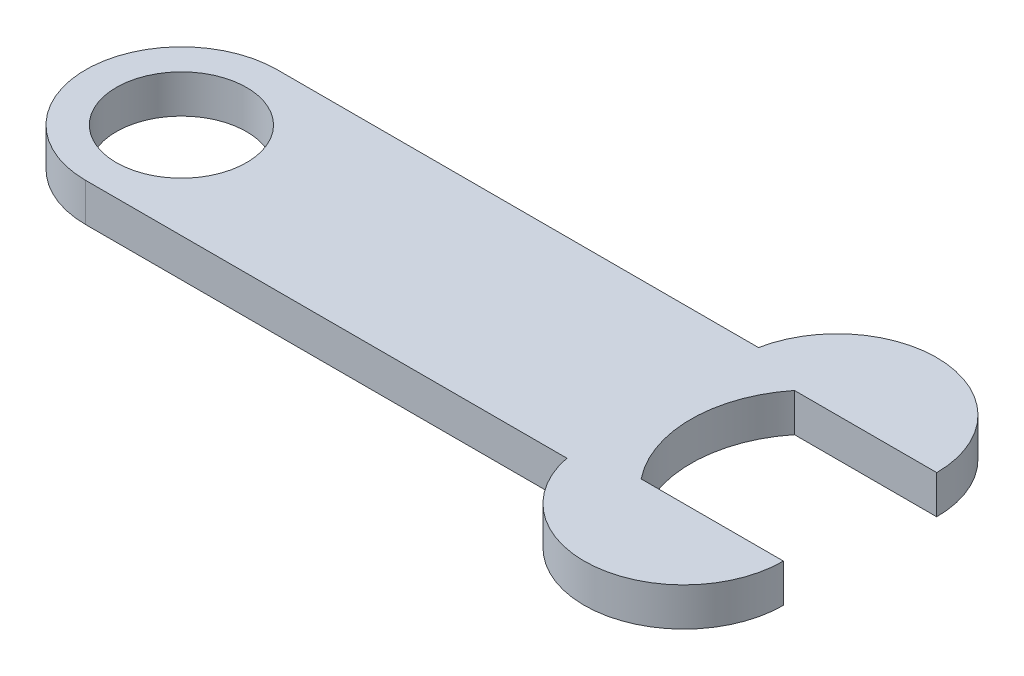
ISO-10303-21;
HEADER;
FILE_DESCRIPTION(('STEP AP214'),'2;1');
FILE_NAME('part.step','',(''),(''),'','','');
FILE_SCHEMA(('AUTOMOTIVE_DESIGN { 1 0 10303 214 1 1 1 1 }'));
ENDSEC;
DATA;
#1=APPLICATION_CONTEXT('core data for automotive mechanical design processes');
#2=APPLICATION_PROTOCOL_DEFINITION('international standard','automotive_design',2000,#1);
#3=PRODUCT_CONTEXT('',#1,'mechanical');
#4=PRODUCT('Part','Part','',(#3));
#5=PRODUCT_RELATED_PRODUCT_CATEGORY('part','',(#4));
#6=PRODUCT_DEFINITION_FORMATION('','',#4);
#7=PRODUCT_DEFINITION_CONTEXT('part definition',#1,'design');
#8=PRODUCT_DEFINITION('design','',#6,#7);
#9=PRODUCT_DEFINITION_SHAPE('','',#8);
#10=(LENGTH_UNIT() NAMED_UNIT(*) SI_UNIT(.MILLI.,.METRE.));
#11=(NAMED_UNIT(*) PLANE_ANGLE_UNIT() SI_UNIT($,.RADIAN.));
#12=(NAMED_UNIT(*) SI_UNIT($,.STERADIAN.) SOLID_ANGLE_UNIT());
#13=UNCERTAINTY_MEASURE_WITH_UNIT(LENGTH_MEASURE(1.E-05),#10,'distance_accuracy_value','');
#14=(GEOMETRIC_REPRESENTATION_CONTEXT(3) GLOBAL_UNCERTAINTY_ASSIGNED_CONTEXT((#13)) GLOBAL_UNIT_ASSIGNED_CONTEXT((#10,
#11,#12)) REPRESENTATION_CONTEXT('',''));
#15=CARTESIAN_POINT('',(0.,0.,0.));
#16=DIRECTION('',(0.,0.,1.));
#17=DIRECTION('',(1.,0.,0.));
#18=AXIS2_PLACEMENT_3D('',#15,#16,#17);
#19=CARTESIAN_POINT('',(-164.9,10.,0.));
#20=DIRECTION('',(0.,1.,0.));
#21=DIRECTION('',(0.,0.,1.));
#22=AXIS2_PLACEMENT_3D('',#19,#20,#21);
#23=PLANE('',#22);
#24=CARTESIAN_POINT('',(-164.9,10.,0.));
#25=DIRECTION('',(0.,1.,0.));
#26=DIRECTION('',(0.,0.,1.));
#27=AXIS2_PLACEMENT_3D('',#24,#25,#26);
#28=CIRCLE('',#27,25.);
#29=CARTESIAN_POINT('',(-164.9,10.,-25.));
#30=VERTEX_POINT('',#29);
#31=CARTESIAN_POINT('',(-164.9,10.,25.));
#32=VERTEX_POINT('',#31);
#33=EDGE_CURVE('E164',#30,#32,#28,.T.);
#34=ORIENTED_EDGE('',*,*,#33,.T.);
#35=DIRECTION('',(1.,0.,0.));
#36=VECTOR('',#35,1.);
#37=CARTESIAN_POINT('',(-39.3147016443461,10.,25.));
#38=LINE('',#37,#36);
#39=CARTESIAN_POINT('',(-39.3147016443461,10.,25.));
#40=VERTEX_POINT('',#39);
#41=EDGE_CURVE('E100',#32,#40,#38,.T.);
#42=ORIENTED_EDGE('',*,*,#41,.T.);
#43=CARTESIAN_POINT('',(-13.8,10.,20.));
#44=DIRECTION('',(0.,1.,0.));
#45=DIRECTION('',(0.,0.,1.));
#46=AXIS2_PLACEMENT_3D('',#43,#44,#45);
#47=CIRCLE('',#46,26.);
#48=CARTESIAN_POINT('',(12.2,10.,20.));
#49=VERTEX_POINT('',#48);
#50=EDGE_CURVE('E185',#40,#49,#47,.T.);
#51=ORIENTED_EDGE('',*,*,#50,.T.);
#52=DIRECTION('',(-1.,0.,0.));
#53=VECTOR('',#52,1.);
#54=CARTESIAN_POINT('',(-24.933996638493,10.,20.));
#55=LINE('',#54,#53);
#56=CARTESIAN_POINT('',(-24.933996638493,10.,20.));
#57=VERTEX_POINT('',#56);
#58=EDGE_CURVE('E199',#49,#57,#55,.T.);
#59=ORIENTED_EDGE('',*,*,#58,.T.);
#60=CARTESIAN_POINT('',(0.0459953551005471,10.,0.));
#61=DIRECTION('',(0.,-1.,0.));
#62=DIRECTION('',(0.,0.,1.));
#63=AXIS2_PLACEMENT_3D('',#60,#61,#62);
#64=CIRCLE('',#63,32.);
#65=CARTESIAN_POINT('',(-24.933996638493,10.,-20.));
#66=VERTEX_POINT('',#65);
#67=EDGE_CURVE('E119',#57,#66,#64,.T.);
#68=ORIENTED_EDGE('',*,*,#67,.T.);
#69=DIRECTION('',(1.,0.,0.));
#70=VECTOR('',#69,1.);
#71=CARTESIAN_POINT('',(-24.933996638493,10.,-20.));
#72=LINE('',#71,#70);
#73=CARTESIAN_POINT('',(12.2,10.,-20.));
#74=VERTEX_POINT('',#73);
#75=EDGE_CURVE('E113',#66,#74,#72,.T.);
#76=ORIENTED_EDGE('',*,*,#75,.T.);
#77=CARTESIAN_POINT('',(-13.8,10.,-20.));
#78=DIRECTION('',(0.,1.,0.));
#79=DIRECTION('',(0.,0.,1.));
#80=AXIS2_PLACEMENT_3D('',#77,#78,#79);
#81=CIRCLE('',#80,26.);
#82=CARTESIAN_POINT('',(-39.3147016443462,10.,-25.));
#83=VERTEX_POINT('',#82);
#84=EDGE_CURVE('E117',#74,#83,#81,.T.);
#85=ORIENTED_EDGE('',*,*,#84,.T.);
#86=DIRECTION('',(-1.,0.,0.));
#87=VECTOR('',#86,1.);
#88=CARTESIAN_POINT('',(-39.3147016443462,10.,-25.));
#89=LINE('',#88,#87);
#90=EDGE_CURVE('E57',#83,#30,#89,.T.);
#91=ORIENTED_EDGE('',*,*,#90,.T.);
#92=EDGE_LOOP('',(#34,#42,#51,#59,#68,#76,#85,#91));
#93=FACE_BOUND('',#92,.T.);
#94=CARTESIAN_POINT('',(-164.9,10.,0.));
#95=DIRECTION('',(0.,1.,0.));
#96=DIRECTION('',(0.,0.,1.));
#97=AXIS2_PLACEMENT_3D('',#94,#95,#96);
#98=CIRCLE('',#97,17.);
#99=CARTESIAN_POINT('',(-164.9,10.,17.));
#100=VERTEX_POINT('',#99);
#101=EDGE_CURVE('E146',#100,#100,#98,.T.);
#102=ORIENTED_EDGE('',*,*,#101,.F.);
#103=EDGE_LOOP('',(#102));
#104=FACE_BOUND('',#103,.T.);
#105=ADVANCED_FACE('F39',(#93,#104),#23,.T.);
#106=CARTESIAN_POINT('',(-164.9,0.,0.));
#107=DIRECTION('',(0.,1.,0.));
#108=DIRECTION('',(0.,0.,1.));
#109=AXIS2_PLACEMENT_3D('',#106,#107,#108);
#110=PLANE('',#109);
#111=CARTESIAN_POINT('',(-164.9,0.,0.));
#112=DIRECTION('',(0.,1.,0.));
#113=DIRECTION('',(0.,0.,1.));
#114=AXIS2_PLACEMENT_3D('',#111,#112,#113);
#115=CIRCLE('',#114,25.);
#116=CARTESIAN_POINT('',(-164.9,0.,-25.));
#117=VERTEX_POINT('',#116);
#118=CARTESIAN_POINT('',(-164.9,0.,25.));
#119=VERTEX_POINT('',#118);
#120=EDGE_CURVE('E141',#117,#119,#115,.T.);
#121=ORIENTED_EDGE('',*,*,#120,.F.);
#122=DIRECTION('',(-1.,0.,0.));
#123=VECTOR('',#122,1.);
#124=CARTESIAN_POINT('',(-39.3147016443462,0.,-25.));
#125=LINE('',#124,#123);
#126=CARTESIAN_POINT('',(-39.3147016443462,0.,-25.));
#127=VERTEX_POINT('',#126);
#128=EDGE_CURVE('E92',#127,#117,#125,.T.);
#129=ORIENTED_EDGE('',*,*,#128,.F.);
#130=CARTESIAN_POINT('',(-13.8,0.,-20.));
#131=DIRECTION('',(0.,1.,0.));
#132=DIRECTION('',(0.,0.,1.));
#133=AXIS2_PLACEMENT_3D('',#130,#131,#132);
#134=CIRCLE('',#133,26.);
#135=CARTESIAN_POINT('',(12.2,0.,-20.));
#136=VERTEX_POINT('',#135);
#137=EDGE_CURVE('E86',#136,#127,#134,.T.);
#138=ORIENTED_EDGE('',*,*,#137,.F.);
#139=DIRECTION('',(1.,0.,0.));
#140=VECTOR('',#139,1.);
#141=CARTESIAN_POINT('',(-24.933996638493,0.,-20.));
#142=LINE('',#141,#140);
#143=CARTESIAN_POINT('',(-24.933996638493,0.,-20.));
#144=VERTEX_POINT('',#143);
#145=EDGE_CURVE('E128',#144,#136,#142,.T.);
#146=ORIENTED_EDGE('',*,*,#145,.F.);
#147=CARTESIAN_POINT('',(0.0459953551005471,0.,0.));
#148=DIRECTION('',(0.,-1.,0.));
#149=DIRECTION('',(0.,0.,1.));
#150=AXIS2_PLACEMENT_3D('',#147,#148,#149);
#151=CIRCLE('',#150,32.);
#152=CARTESIAN_POINT('',(-24.933996638493,0.,20.));
#153=VERTEX_POINT('',#152);
#154=EDGE_CURVE('E155',#153,#144,#151,.T.);
#155=ORIENTED_EDGE('',*,*,#154,.F.);
#156=DIRECTION('',(-1.,0.,0.));
#157=VECTOR('',#156,1.);
#158=CARTESIAN_POINT('',(-24.933996638493,0.,20.));
#159=LINE('',#158,#157);
#160=CARTESIAN_POINT('',(12.2,0.,20.));
#161=VERTEX_POINT('',#160);
#162=EDGE_CURVE('E152',#161,#153,#159,.T.);
#163=ORIENTED_EDGE('',*,*,#162,.F.);
#164=CARTESIAN_POINT('',(-13.8,0.,20.));
#165=DIRECTION('',(0.,1.,0.));
#166=DIRECTION('',(0.,0.,1.));
#167=AXIS2_PLACEMENT_3D('',#164,#165,#166);
#168=CIRCLE('',#167,26.);
#169=CARTESIAN_POINT('',(-39.3147016443461,0.,25.));
#170=VERTEX_POINT('',#169);
#171=EDGE_CURVE('E149',#170,#161,#168,.T.);
#172=ORIENTED_EDGE('',*,*,#171,.F.);
#173=DIRECTION('',(1.,0.,0.));
#174=VECTOR('',#173,1.);
#175=CARTESIAN_POINT('',(-39.3147016443461,0.,25.));
#176=LINE('',#175,#174);
#177=EDGE_CURVE('E145',#119,#170,#176,.T.);
#178=ORIENTED_EDGE('',*,*,#177,.F.);
#179=EDGE_LOOP('',(#121,#129,#138,#146,#155,#163,#172,#178));
#180=FACE_BOUND('',#179,.T.);
#181=CARTESIAN_POINT('',(-164.9,0.,0.));
#182=DIRECTION('',(0.,1.,0.));
#183=DIRECTION('',(0.,0.,1.));
#184=AXIS2_PLACEMENT_3D('',#181,#182,#183);
#185=CIRCLE('',#184,17.);
#186=CARTESIAN_POINT('',(-164.9,0.,17.));
#187=VERTEX_POINT('',#186);
#188=EDGE_CURVE('E209',#187,#187,#185,.T.);
#189=ORIENTED_EDGE('',*,*,#188,.T.);
#190=EDGE_LOOP('',(#189));
#191=FACE_BOUND('',#190,.T.);
#192=ADVANCED_FACE('F189',(#180,#191),#110,.F.);
#193=CARTESIAN_POINT('',(-164.9,10.,0.));
#194=DIRECTION('',(0.,-1.,0.));
#195=DIRECTION('',(0.,0.,-1.));
#196=AXIS2_PLACEMENT_3D('',#193,#194,#195);
#197=CYLINDRICAL_SURFACE('',#196,25.);
#198=ORIENTED_EDGE('',*,*,#120,.T.);
#199=DIRECTION('',(0.,-1.,0.));
#200=VECTOR('',#199,1.);
#201=CARTESIAN_POINT('',(-164.9,10.,25.));
#202=LINE('',#201,#200);
#203=EDGE_CURVE('E11',#32,#119,#202,.T.);
#204=ORIENTED_EDGE('',*,*,#203,.F.);
#205=ORIENTED_EDGE('',*,*,#33,.F.);
#206=DIRECTION('',(0.,-1.,0.));
#207=VECTOR('',#206,1.);
#208=CARTESIAN_POINT('',(-164.9,10.,-25.));
#209=LINE('',#208,#207);
#210=EDGE_CURVE('E137',#30,#117,#209,.T.);
#211=ORIENTED_EDGE('',*,*,#210,.T.);
#212=EDGE_LOOP('',(#198,#204,#205,#211));
#213=FACE_BOUND('',#212,.T.);
#214=ADVANCED_FACE('F41',(#213),#197,.T.);
#215=CARTESIAN_POINT('',(-39.3147016443461,10.,25.));
#216=DIRECTION('',(0.,0.,-1.));
#217=DIRECTION('',(-1.,0.,0.));
#218=AXIS2_PLACEMENT_3D('',#215,#216,#217);
#219=PLANE('',#218);
#220=ORIENTED_EDGE('',*,*,#177,.T.);
#221=DIRECTION('',(0.,-1.,0.));
#222=VECTOR('',#221,1.);
#223=CARTESIAN_POINT('',(-39.3147016443461,10.,25.));
#224=LINE('',#223,#222);
#225=EDGE_CURVE('E49',#40,#170,#224,.T.);
#226=ORIENTED_EDGE('',*,*,#225,.F.);
#227=ORIENTED_EDGE('',*,*,#41,.F.);
#228=ORIENTED_EDGE('',*,*,#203,.T.);
#229=EDGE_LOOP('',(#220,#226,#227,#228));
#230=FACE_BOUND('',#229,.T.);
#231=ADVANCED_FACE('F239',(#230),#219,.F.);
#232=CARTESIAN_POINT('',(-13.8,10.,20.));
#233=DIRECTION('',(0.,-1.,0.));
#234=DIRECTION('',(0.,0.,-1.));
#235=AXIS2_PLACEMENT_3D('',#232,#233,#234);
#236=CYLINDRICAL_SURFACE('',#235,26.);
#237=ORIENTED_EDGE('',*,*,#171,.T.);
#238=DIRECTION('',(0.,-1.,0.));
#239=VECTOR('',#238,1.);
#240=CARTESIAN_POINT('',(12.2,10.,20.));
#241=LINE('',#240,#239);
#242=EDGE_CURVE('E175',#49,#161,#241,.T.);
#243=ORIENTED_EDGE('',*,*,#242,.F.);
#244=ORIENTED_EDGE('',*,*,#50,.F.);
#245=ORIENTED_EDGE('',*,*,#225,.T.);
#246=EDGE_LOOP('',(#237,#243,#244,#245));
#247=FACE_BOUND('',#246,.T.);
#248=ADVANCED_FACE('F183',(#247),#236,.T.);
#249=CARTESIAN_POINT('',(-24.933996638493,10.,20.));
#250=DIRECTION('',(0.,0.,1.));
#251=DIRECTION('',(1.,0.,0.));
#252=AXIS2_PLACEMENT_3D('',#249,#250,#251);
#253=PLANE('',#252);
#254=ORIENTED_EDGE('',*,*,#162,.T.);
#255=DIRECTION('',(0.,-1.,0.));
#256=VECTOR('',#255,1.);
#257=CARTESIAN_POINT('',(-24.933996638493,10.,20.));
#258=LINE('',#257,#256);
#259=EDGE_CURVE('E171',#57,#153,#258,.T.);
#260=ORIENTED_EDGE('',*,*,#259,.F.);
#261=ORIENTED_EDGE('',*,*,#58,.F.);
#262=ORIENTED_EDGE('',*,*,#242,.T.);
#263=EDGE_LOOP('',(#254,#260,#261,#262));
#264=FACE_BOUND('',#263,.T.);
#265=ADVANCED_FACE('F194',(#264),#253,.F.);
#266=CARTESIAN_POINT('',(0.0459953551005471,10.,0.));
#267=DIRECTION('',(0.,-1.,0.));
#268=DIRECTION('',(0.,0.,-1.));
#269=AXIS2_PLACEMENT_3D('',#266,#267,#268);
#270=CYLINDRICAL_SURFACE('',#269,32.);
#271=ORIENTED_EDGE('',*,*,#154,.T.);
#272=DIRECTION('',(0.,-1.,0.));
#273=VECTOR('',#272,1.);
#274=CARTESIAN_POINT('',(-24.933996638493,10.,-20.));
#275=LINE('',#274,#273);
#276=EDGE_CURVE('E130',#66,#144,#275,.T.);
#277=ORIENTED_EDGE('',*,*,#276,.F.);
#278=ORIENTED_EDGE('',*,*,#67,.F.);
#279=ORIENTED_EDGE('',*,*,#259,.T.);
#280=EDGE_LOOP('',(#271,#277,#278,#279));
#281=FACE_BOUND('',#280,.T.);
#282=ADVANCED_FACE('F197',(#281),#270,.F.);
#283=CARTESIAN_POINT('',(-24.933996638493,10.,-20.));
#284=DIRECTION('',(0.,0.,-1.));
#285=DIRECTION('',(-1.,0.,0.));
#286=AXIS2_PLACEMENT_3D('',#283,#284,#285);
#287=PLANE('',#286);
#288=ORIENTED_EDGE('',*,*,#145,.T.);
#289=DIRECTION('',(0.,-1.,0.));
#290=VECTOR('',#289,1.);
#291=CARTESIAN_POINT('',(12.2,10.,-20.));
#292=LINE('',#291,#290);
#293=EDGE_CURVE('E125',#74,#136,#292,.T.);
#294=ORIENTED_EDGE('',*,*,#293,.F.);
#295=ORIENTED_EDGE('',*,*,#75,.F.);
#296=ORIENTED_EDGE('',*,*,#276,.T.);
#297=EDGE_LOOP('',(#288,#294,#295,#296));
#298=FACE_BOUND('',#297,.T.);
#299=ADVANCED_FACE('F126',(#298),#287,.F.);
#300=CARTESIAN_POINT('',(-13.8,10.,-20.));
#301=DIRECTION('',(0.,-1.,0.));
#302=DIRECTION('',(0.,0.,-1.));
#303=AXIS2_PLACEMENT_3D('',#300,#301,#302);
#304=CYLINDRICAL_SURFACE('',#303,26.);
#305=ORIENTED_EDGE('',*,*,#137,.T.);
#306=DIRECTION('',(0.,-1.,0.));
#307=VECTOR('',#306,1.);
#308=CARTESIAN_POINT('',(-39.3147016443462,10.,-25.));
#309=LINE('',#308,#307);
#310=EDGE_CURVE('E131',#83,#127,#309,.T.);
#311=ORIENTED_EDGE('',*,*,#310,.F.);
#312=ORIENTED_EDGE('',*,*,#84,.F.);
#313=ORIENTED_EDGE('',*,*,#293,.T.);
#314=EDGE_LOOP('',(#305,#311,#312,#313));
#315=FACE_BOUND('',#314,.T.);
#316=ADVANCED_FACE('F133',(#315),#304,.T.);
#317=CARTESIAN_POINT('',(-39.3147016443462,10.,-25.));
#318=DIRECTION('',(0.,0.,1.));
#319=DIRECTION('',(1.,0.,0.));
#320=AXIS2_PLACEMENT_3D('',#317,#318,#319);
#321=PLANE('',#320);
#322=ORIENTED_EDGE('',*,*,#128,.T.);
#323=ORIENTED_EDGE('',*,*,#210,.F.);
#324=ORIENTED_EDGE('',*,*,#90,.F.);
#325=ORIENTED_EDGE('',*,*,#310,.T.);
#326=EDGE_LOOP('',(#322,#323,#324,#325));
#327=FACE_BOUND('',#326,.T.);
#328=ADVANCED_FACE('F227',(#327),#321,.F.);
#329=CARTESIAN_POINT('',(-164.9,10.,0.));
#330=DIRECTION('',(0.,-1.,0.));
#331=DIRECTION('',(0.,0.,-1.));
#332=AXIS2_PLACEMENT_3D('',#329,#330,#331);
#333=CYLINDRICAL_SURFACE('',#332,17.);
#334=ORIENTED_EDGE('',*,*,#101,.T.);
#335=EDGE_LOOP('',(#334));
#336=FACE_BOUND('',#335,.T.);
#337=ORIENTED_EDGE('',*,*,#188,.F.);
#338=EDGE_LOOP('',(#337));
#339=FACE_BOUND('',#338,.T.);
#340=ADVANCED_FACE('F217',(#336,#339),#333,.F.);
#341=CLOSED_SHELL('',(#105,#192,#214,#231,#248,#265,#282,#299,#316,#328,#340));
#342=MANIFOLD_SOLID_BREP('B2',#341);
#343=ADVANCED_BREP_SHAPE_REPRESENTATION('',(#18,#342),#14);
#344=SHAPE_DEFINITION_REPRESENTATION(#9,#343);
ENDSEC;
END-ISO-10303-21;
